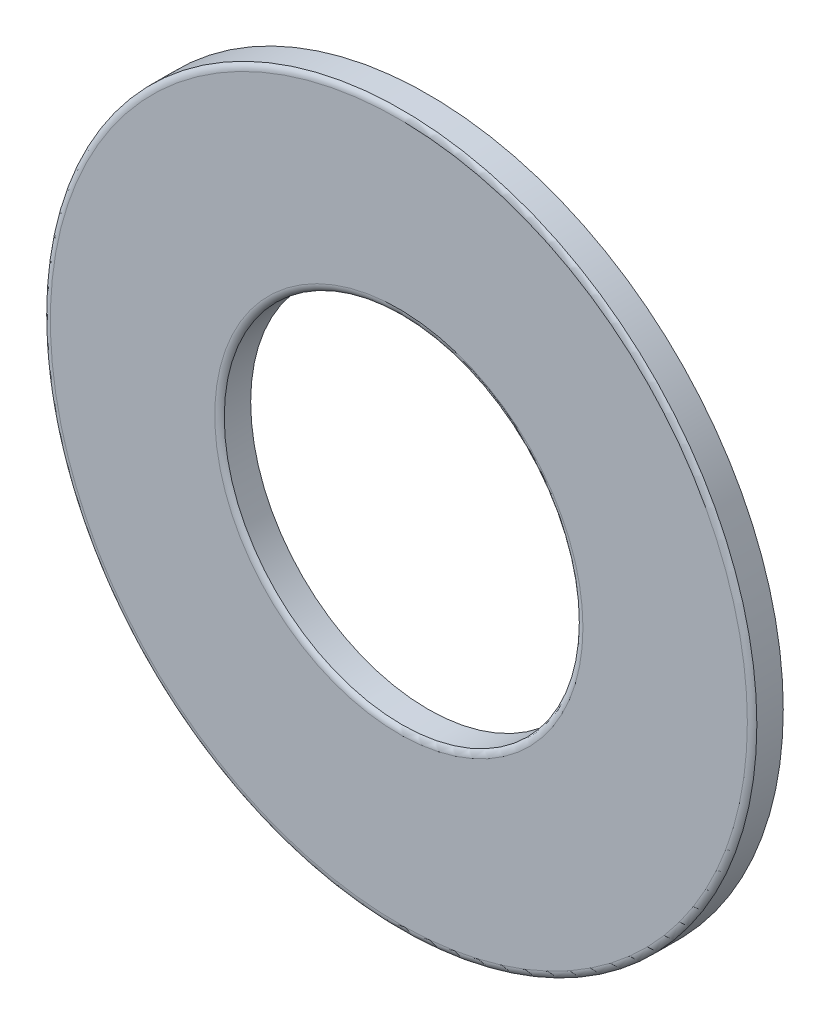
ISO-10303-21;
HEADER;
FILE_DESCRIPTION(('STEP AP214'),'2;1');
FILE_NAME('part.step','',(''),(''),'','','');
FILE_SCHEMA(('AUTOMOTIVE_DESIGN { 1 0 10303 214 1 1 1 1 }'));
ENDSEC;
DATA;
#1=APPLICATION_CONTEXT('core data for automotive mechanical design processes');
#2=APPLICATION_PROTOCOL_DEFINITION('international standard','automotive_design',2000,#1);
#3=PRODUCT_CONTEXT('',#1,'mechanical');
#4=PRODUCT('Part','Part','',(#3));
#5=PRODUCT_RELATED_PRODUCT_CATEGORY('part','',(#4));
#6=PRODUCT_DEFINITION_FORMATION('','',#4);
#7=PRODUCT_DEFINITION_CONTEXT('part definition',#1,'design');
#8=PRODUCT_DEFINITION('design','',#6,#7);
#9=PRODUCT_DEFINITION_SHAPE('','',#8);
#10=(LENGTH_UNIT() NAMED_UNIT(*) SI_UNIT(.MILLI.,.METRE.));
#11=(NAMED_UNIT(*) PLANE_ANGLE_UNIT() SI_UNIT($,.RADIAN.));
#12=(NAMED_UNIT(*) SI_UNIT($,.STERADIAN.) SOLID_ANGLE_UNIT());
#13=UNCERTAINTY_MEASURE_WITH_UNIT(LENGTH_MEASURE(1.E-05),#10,'distance_accuracy_value','');
#14=(GEOMETRIC_REPRESENTATION_CONTEXT(3) GLOBAL_UNCERTAINTY_ASSIGNED_CONTEXT((#13)) GLOBAL_UNIT_ASSIGNED_CONTEXT((#10,
#11,#12)) REPRESENTATION_CONTEXT('',''));
#15=CARTESIAN_POINT('',(0.,0.,0.));
#16=DIRECTION('',(0.,0.,1.));
#17=DIRECTION('',(1.,0.,0.));
#18=AXIS2_PLACEMENT_3D('',#15,#16,#17);
#19=CARTESIAN_POINT('',(0.,0.,0.787400000000002));
#20=DIRECTION('',(0.,0.,1.));
#21=DIRECTION('',(1.,0.,0.));
#22=AXIS2_PLACEMENT_3D('',#19,#20,#21);
#23=PLANE('',#22);
#24=CARTESIAN_POINT('',(0.,0.,0.787400000000002));
#25=DIRECTION('',(0.,0.,1.));
#26=DIRECTION('',(1.,0.,0.));
#27=AXIS2_PLACEMENT_3D('',#24,#25,#26);
#28=CIRCLE('',#27,9.87713598509667);
#29=CARTESIAN_POINT('',(9.87713598509667,0.,0.787400000000002));
#30=VERTEX_POINT('',#29);
#31=EDGE_CURVE('E10',#30,#30,#28,.F.);
#32=ORIENTED_EDGE('',*,*,#31,.T.);
#33=EDGE_LOOP('',(#32));
#34=FACE_BOUND('',#33,.T.);
#35=CARTESIAN_POINT('',(0.,0.,0.787400000000002));
#36=DIRECTION('',(0.,0.,1.));
#37=DIRECTION('',(1.,0.,0.));
#38=AXIS2_PLACEMENT_3D('',#35,#36,#37);
#39=CIRCLE('',#38,18.6978640149034);
#40=CARTESIAN_POINT('',(18.6978640149034,0.,0.787400000000002));
#41=VERTEX_POINT('',#40);
#42=EDGE_CURVE('E37',#41,#41,#39,.T.);
#43=ORIENTED_EDGE('',*,*,#42,.T.);
#44=EDGE_LOOP('',(#43));
#45=FACE_BOUND('',#44,.T.);
#46=ADVANCED_FACE('F30',(#34,#45),#23,.T.);
#47=CARTESIAN_POINT('',(0.,0.,-0.787399999999998));
#48=DIRECTION('',(0.,0.,1.));
#49=DIRECTION('',(1.,0.,0.));
#50=AXIS2_PLACEMENT_3D('',#47,#48,#49);
#51=PLANE('',#50);
#52=CARTESIAN_POINT('',(0.,0.,-0.787399999999998));
#53=DIRECTION('',(0.,0.,1.));
#54=DIRECTION('',(1.,0.,0.));
#55=AXIS2_PLACEMENT_3D('',#52,#53,#54);
#56=CIRCLE('',#55,19.05);
#57=CARTESIAN_POINT('',(19.05,0.,-0.787399999999998));
#58=VERTEX_POINT('',#57);
#59=EDGE_CURVE('E50',#58,#58,#56,.T.);
#60=ORIENTED_EDGE('',*,*,#59,.F.);
#61=EDGE_LOOP('',(#60));
#62=FACE_BOUND('',#61,.T.);
#63=CARTESIAN_POINT('',(0.,0.,-0.787399999999998));
#64=DIRECTION('',(0.,0.,1.));
#65=DIRECTION('',(1.,0.,0.));
#66=AXIS2_PLACEMENT_3D('',#63,#64,#65);
#67=CIRCLE('',#66,9.525);
#68=CARTESIAN_POINT('',(9.525,0.,-0.787399999999998));
#69=VERTEX_POINT('',#68);
#70=EDGE_CURVE('E53',#69,#69,#67,.T.);
#71=ORIENTED_EDGE('',*,*,#70,.T.);
#72=EDGE_LOOP('',(#71));
#73=FACE_BOUND('',#72,.T.);
#74=ADVANCED_FACE('F57',(#62,#73),#51,.F.);
#75=CARTESIAN_POINT('',(0.,0.,0.787400000000002));
#76=DIRECTION('',(0.,0.,-1.));
#77=DIRECTION('',(-1.,0.,0.));
#78=AXIS2_PLACEMENT_3D('',#75,#76,#77);
#79=CYLINDRICAL_SURFACE('',#78,19.05);
#80=CARTESIAN_POINT('',(0.,0.,0.629920000000021));
#81=DIRECTION('',(0.,0.,1.));
#82=DIRECTION('',(1.,0.,0.));
#83=AXIS2_PLACEMENT_3D('',#80,#81,#82);
#84=CIRCLE('',#83,19.05);
#85=CARTESIAN_POINT('',(19.05,0.,0.629920000000021));
#86=VERTEX_POINT('',#85);
#87=EDGE_CURVE('E45',#86,#86,#84,.F.);
#88=ORIENTED_EDGE('',*,*,#87,.T.);
#89=EDGE_LOOP('',(#88));
#90=FACE_BOUND('',#89,.T.);
#91=ORIENTED_EDGE('',*,*,#59,.T.);
#92=EDGE_LOOP('',(#91));
#93=FACE_BOUND('',#92,.T.);
#94=ADVANCED_FACE('F62',(#90,#93),#79,.T.);
#95=CARTESIAN_POINT('',(0.,0.,0.787400000000002));
#96=DIRECTION('',(0.,0.,-1.));
#97=DIRECTION('',(-1.,0.,0.));
#98=AXIS2_PLACEMENT_3D('',#95,#96,#97);
#99=CYLINDRICAL_SURFACE('',#98,9.525);
#100=CARTESIAN_POINT('',(0.,0.,0.629919999999997));
#101=DIRECTION('',(0.,0.,1.));
#102=DIRECTION('',(1.,0.,0.));
#103=AXIS2_PLACEMENT_3D('',#100,#101,#102);
#104=CIRCLE('',#103,9.525);
#105=CARTESIAN_POINT('',(9.525,0.,0.629919999999997));
#106=VERTEX_POINT('',#105);
#107=EDGE_CURVE('E41',#106,#106,#104,.T.);
#108=ORIENTED_EDGE('',*,*,#107,.T.);
#109=EDGE_LOOP('',(#108));
#110=FACE_BOUND('',#109,.T.);
#111=ORIENTED_EDGE('',*,*,#70,.F.);
#112=EDGE_LOOP('',(#111));
#113=FACE_BOUND('',#112,.T.);
#114=ADVANCED_FACE('F59',(#110,#113),#99,.F.);
#115=CARTESIAN_POINT('',(0.,0.,0.314960000000002));
#116=DIRECTION('',(0.,0.,1.));
#117=DIRECTION('',(1.,0.,0.));
#118=AXIS2_PLACEMENT_3D('',#115,#116,#117);
#119=TOROIDAL_SURFACE('',#118,9.87713598509667,0.47244);
#120=ORIENTED_EDGE('',*,*,#107,.F.);
#121=EDGE_LOOP('',(#120));
#122=FACE_BOUND('',#121,.T.);
#123=ORIENTED_EDGE('',*,*,#31,.F.);
#124=EDGE_LOOP('',(#123));
#125=FACE_BOUND('',#124,.T.);
#126=ADVANCED_FACE('F61',(#122,#125),#119,.T.);
#127=CARTESIAN_POINT('',(0.,0.,0.314960000000002));
#128=DIRECTION('',(0.,0.,-1.));
#129=DIRECTION('',(-1.,0.,0.));
#130=AXIS2_PLACEMENT_3D('',#127,#128,#129);
#131=TOROIDAL_SURFACE('',#130,18.6978640149034,0.47244);
#132=ORIENTED_EDGE('',*,*,#87,.F.);
#133=EDGE_LOOP('',(#132));
#134=FACE_BOUND('',#133,.T.);
#135=ORIENTED_EDGE('',*,*,#42,.F.);
#136=EDGE_LOOP('',(#135));
#137=FACE_BOUND('',#136,.T.);
#138=ADVANCED_FACE('F32',(#134,#137),#131,.T.);
#139=CLOSED_SHELL('',(#46,#74,#94,#114,#126,#138));
#140=MANIFOLD_SOLID_BREP('B2',#139);
#141=ADVANCED_BREP_SHAPE_REPRESENTATION('',(#18,#140),#14);
#142=SHAPE_DEFINITION_REPRESENTATION(#9,#141);
ENDSEC;
END-ISO-10303-21;
